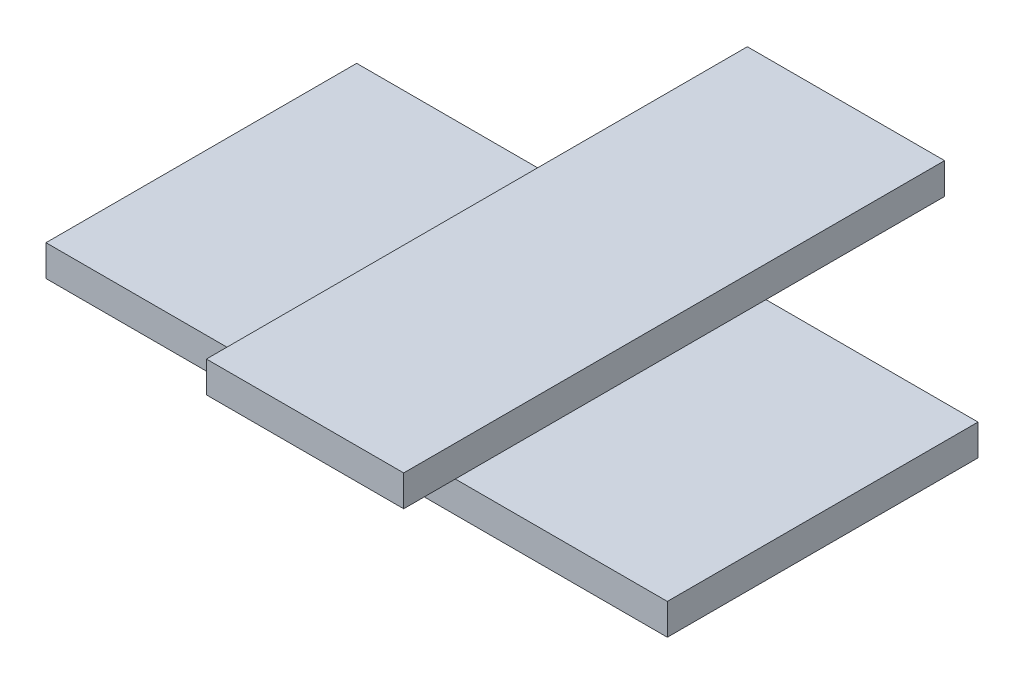
ISO-10303-21;
HEADER;
FILE_DESCRIPTION(('STEP AP214'),'2;1');
FILE_NAME('part.step','',(''),(''),'','','');
FILE_SCHEMA(('AUTOMOTIVE_DESIGN { 1 0 10303 214 1 1 1 1 }'));
ENDSEC;
DATA;
#1=APPLICATION_CONTEXT('core data for automotive mechanical design processes');
#2=APPLICATION_PROTOCOL_DEFINITION('international standard','automotive_design',2000,#1);
#3=PRODUCT_CONTEXT('',#1,'mechanical');
#4=PRODUCT('Part','Part','',(#3));
#5=PRODUCT_RELATED_PRODUCT_CATEGORY('part','',(#4));
#6=PRODUCT_DEFINITION_FORMATION('','',#4);
#7=PRODUCT_DEFINITION_CONTEXT('part definition',#1,'design');
#8=PRODUCT_DEFINITION('design','',#6,#7);
#9=PRODUCT_DEFINITION_SHAPE('','',#8);
#10=(LENGTH_UNIT() NAMED_UNIT(*) SI_UNIT(.MILLI.,.METRE.));
#11=(NAMED_UNIT(*) PLANE_ANGLE_UNIT() SI_UNIT($,.RADIAN.));
#12=(NAMED_UNIT(*) SI_UNIT($,.STERADIAN.) SOLID_ANGLE_UNIT());
#13=UNCERTAINTY_MEASURE_WITH_UNIT(LENGTH_MEASURE(1.E-05),#10,'distance_accuracy_value','');
#14=(GEOMETRIC_REPRESENTATION_CONTEXT(3) GLOBAL_UNCERTAINTY_ASSIGNED_CONTEXT((#13)) GLOBAL_UNIT_ASSIGNED_CONTEXT((#10,
#11,#12)) REPRESENTATION_CONTEXT('',''));
#15=CARTESIAN_POINT('',(0.,0.,0.));
#16=DIRECTION('',(0.,0.,1.));
#17=DIRECTION('',(1.,0.,0.));
#18=AXIS2_PLACEMENT_3D('',#15,#16,#17);
#19=CARTESIAN_POINT('',(0.,10.,0.));
#20=DIRECTION('',(0.,-1.,0.));
#21=DIRECTION('',(0.,0.,-1.));
#22=AXIS2_PLACEMENT_3D('',#19,#20,#21);
#23=PLANE('',#22);
#24=DIRECTION('',(0.,0.,1.));
#25=VECTOR('',#24,1.);
#26=CARTESIAN_POINT('',(68.25,10.,-157.505814462809));
#27=LINE('',#26,#25);
#28=CARTESIAN_POINT('',(68.25,10.,-100.));
#29=VERTEX_POINT('',#28);
#30=CARTESIAN_POINT('',(68.25,10.,0.));
#31=VERTEX_POINT('',#30);
#32=EDGE_CURVE('E11',#29,#31,#27,.T.);
#33=ORIENTED_EDGE('',*,*,#32,.F.);
#34=DIRECTION('',(-1.,0.,0.));
#35=VECTOR('',#34,1.);
#36=CARTESIAN_POINT('',(0.,10.,-100.));
#37=LINE('',#36,#35);
#38=CARTESIAN_POINT('',(0.,10.,-100.));
#39=VERTEX_POINT('',#38);
#40=EDGE_CURVE('E171',#29,#39,#37,.T.);
#41=ORIENTED_EDGE('',*,*,#40,.T.);
#42=DIRECTION('',(0.,0.,1.));
#43=VECTOR('',#42,1.);
#44=CARTESIAN_POINT('',(0.,10.,0.));
#45=LINE('',#44,#43);
#46=CARTESIAN_POINT('',(0.,10.,0.));
#47=VERTEX_POINT('',#46);
#48=EDGE_CURVE('E158',#39,#47,#45,.T.);
#49=ORIENTED_EDGE('',*,*,#48,.T.);
#50=DIRECTION('',(1.,0.,0.));
#51=VECTOR('',#50,1.);
#52=CARTESIAN_POINT('',(0.,10.,0.));
#53=LINE('',#52,#51);
#54=EDGE_CURVE('E164',#47,#31,#53,.T.);
#55=ORIENTED_EDGE('',*,*,#54,.T.);
#56=EDGE_LOOP('',(#33,#41,#49,#55));
#57=FACE_BOUND('',#56,.T.);
#58=ADVANCED_FACE('F39',(#57),#23,.F.);
#59=DIRECTION('',(0.,0.,-1.));
#60=VECTOR('',#59,1.);
#61=CARTESIAN_POINT('',(131.75,10.,-157.505814462809));
#62=LINE('',#61,#60);
#63=CARTESIAN_POINT('',(131.75,10.,0.));
#64=VERTEX_POINT('',#63);
#65=CARTESIAN_POINT('',(131.75,10.,-100.));
#66=VERTEX_POINT('',#65);
#67=EDGE_CURVE('E49',#64,#66,#62,.T.);
#68=ORIENTED_EDGE('',*,*,#67,.F.);
#69=CARTESIAN_POINT('',(200.,10.,0.));
#70=VERTEX_POINT('',#69);
#71=EDGE_CURVE('E162',#64,#70,#53,.T.);
#72=ORIENTED_EDGE('',*,*,#71,.T.);
#73=DIRECTION('',(0.,0.,-1.));
#74=VECTOR('',#73,1.);
#75=CARTESIAN_POINT('',(200.,10.,0.));
#76=LINE('',#75,#74);
#77=CARTESIAN_POINT('',(200.,10.,-100.));
#78=VERTEX_POINT('',#77);
#79=EDGE_CURVE('E167',#70,#78,#76,.T.);
#80=ORIENTED_EDGE('',*,*,#79,.T.);
#81=EDGE_CURVE('E172',#78,#66,#37,.T.);
#82=ORIENTED_EDGE('',*,*,#81,.T.);
#83=EDGE_LOOP('',(#68,#72,#80,#82));
#84=FACE_BOUND('',#83,.T.);
#85=ADVANCED_FACE('F251',(#84),#23,.F.);
#86=CARTESIAN_POINT('',(0.,10.,0.));
#87=DIRECTION('',(1.,0.,0.));
#88=DIRECTION('',(0.,0.,-1.));
#89=AXIS2_PLACEMENT_3D('',#86,#87,#88);
#90=PLANE('',#89);
#91=DIRECTION('',(0.,0.,1.));
#92=VECTOR('',#91,1.);
#93=CARTESIAN_POINT('',(0.,0.,0.));
#94=LINE('',#93,#92);
#95=CARTESIAN_POINT('',(0.,0.,-100.));
#96=VERTEX_POINT('',#95);
#97=CARTESIAN_POINT('',(0.,0.,0.));
#98=VERTEX_POINT('',#97);
#99=EDGE_CURVE('E147',#96,#98,#94,.T.);
#100=ORIENTED_EDGE('',*,*,#99,.T.);
#101=DIRECTION('',(0.,-1.,0.));
#102=VECTOR('',#101,1.);
#103=CARTESIAN_POINT('',(0.,10.,0.));
#104=LINE('',#103,#102);
#105=EDGE_CURVE('E43',#47,#98,#104,.T.);
#106=ORIENTED_EDGE('',*,*,#105,.F.);
#107=ORIENTED_EDGE('',*,*,#48,.F.);
#108=DIRECTION('',(0.,-1.,0.));
#109=VECTOR('',#108,1.);
#110=CARTESIAN_POINT('',(0.,10.,-100.));
#111=LINE('',#110,#109);
#112=EDGE_CURVE('E174',#39,#96,#111,.T.);
#113=ORIENTED_EDGE('',*,*,#112,.T.);
#114=EDGE_LOOP('',(#100,#106,#107,#113));
#115=FACE_BOUND('',#114,.T.);
#116=ADVANCED_FACE('F41',(#115),#90,.F.);
#117=CARTESIAN_POINT('',(0.,10.,0.));
#118=DIRECTION('',(0.,0.,-1.));
#119=DIRECTION('',(-1.,0.,0.));
#120=AXIS2_PLACEMENT_3D('',#117,#118,#119);
#121=PLANE('',#120);
#122=DIRECTION('',(1.,0.,0.));
#123=VECTOR('',#122,1.);
#124=CARTESIAN_POINT('',(0.,0.,0.));
#125=LINE('',#124,#123);
#126=CARTESIAN_POINT('',(200.,0.,0.));
#127=VERTEX_POINT('',#126);
#128=EDGE_CURVE('E152',#98,#127,#125,.T.);
#129=ORIENTED_EDGE('',*,*,#128,.T.);
#130=DIRECTION('',(0.,-1.,0.));
#131=VECTOR('',#130,1.);
#132=CARTESIAN_POINT('',(200.,10.,0.));
#133=LINE('',#132,#131);
#134=EDGE_CURVE('E190',#70,#127,#133,.T.);
#135=ORIENTED_EDGE('',*,*,#134,.F.);
#136=ORIENTED_EDGE('',*,*,#71,.F.);
#137=EDGE_CURVE('E168',#31,#64,#53,.T.);
#138=ORIENTED_EDGE('',*,*,#137,.F.);
#139=ORIENTED_EDGE('',*,*,#54,.F.);
#140=ORIENTED_EDGE('',*,*,#105,.T.);
#141=EDGE_LOOP('',(#129,#135,#136,#138,#139,#140));
#142=FACE_BOUND('',#141,.T.);
#143=ADVANCED_FACE('F247',(#142),#121,.F.);
#144=CARTESIAN_POINT('',(200.,10.,0.));
#145=DIRECTION('',(-1.,0.,0.));
#146=DIRECTION('',(0.,0.,1.));
#147=AXIS2_PLACEMENT_3D('',#144,#145,#146);
#148=PLANE('',#147);
#149=DIRECTION('',(0.,0.,-1.));
#150=VECTOR('',#149,1.);
#151=CARTESIAN_POINT('',(200.,0.,0.));
#152=LINE('',#151,#150);
#153=CARTESIAN_POINT('',(200.,0.,-100.));
#154=VERTEX_POINT('',#153);
#155=EDGE_CURVE('E179',#127,#154,#152,.T.);
#156=ORIENTED_EDGE('',*,*,#155,.T.);
#157=DIRECTION('',(0.,-1.,0.));
#158=VECTOR('',#157,1.);
#159=CARTESIAN_POINT('',(200.,10.,-100.));
#160=LINE('',#159,#158);
#161=EDGE_CURVE('E187',#78,#154,#160,.T.);
#162=ORIENTED_EDGE('',*,*,#161,.F.);
#163=ORIENTED_EDGE('',*,*,#79,.F.);
#164=ORIENTED_EDGE('',*,*,#134,.T.);
#165=EDGE_LOOP('',(#156,#162,#163,#164));
#166=FACE_BOUND('',#165,.T.);
#167=ADVANCED_FACE('F250',(#166),#148,.F.);
#168=CARTESIAN_POINT('',(0.,10.,-100.));
#169=DIRECTION('',(0.,0.,1.));
#170=DIRECTION('',(1.,0.,0.));
#171=AXIS2_PLACEMENT_3D('',#168,#169,#170);
#172=PLANE('',#171);
#173=DIRECTION('',(-1.,0.,0.));
#174=VECTOR('',#173,1.);
#175=CARTESIAN_POINT('',(0.,0.,-100.));
#176=LINE('',#175,#174);
#177=EDGE_CURVE('E163',#154,#96,#176,.T.);
#178=ORIENTED_EDGE('',*,*,#177,.T.);
#179=ORIENTED_EDGE('',*,*,#112,.F.);
#180=ORIENTED_EDGE('',*,*,#40,.F.);
#181=EDGE_CURVE('E175',#66,#29,#37,.T.);
#182=ORIENTED_EDGE('',*,*,#181,.F.);
#183=ORIENTED_EDGE('',*,*,#81,.F.);
#184=ORIENTED_EDGE('',*,*,#161,.T.);
#185=EDGE_LOOP('',(#178,#179,#180,#182,#183,#184));
#186=FACE_BOUND('',#185,.T.);
#187=ADVANCED_FACE('F241',(#186),#172,.F.);
#188=CARTESIAN_POINT('',(0.,0.,0.));
#189=DIRECTION('',(0.,-1.,0.));
#190=DIRECTION('',(0.,0.,-1.));
#191=AXIS2_PLACEMENT_3D('',#188,#189,#190);
#192=PLANE('',#191);
#193=ORIENTED_EDGE('',*,*,#99,.F.);
#194=ORIENTED_EDGE('',*,*,#177,.F.);
#195=ORIENTED_EDGE('',*,*,#155,.F.);
#196=ORIENTED_EDGE('',*,*,#128,.F.);
#197=EDGE_LOOP('',(#193,#194,#195,#196));
#198=FACE_BOUND('',#197,.T.);
#199=ADVANCED_FACE('F246',(#198),#192,.T.);
#200=CARTESIAN_POINT('',(0.,10.,0.));
#201=DIRECTION('',(0.,1.,0.));
#202=DIRECTION('',(0.,0.,1.));
#203=AXIS2_PLACEMENT_3D('',#200,#201,#202);
#204=PLANE('',#203);
#205=CARTESIAN_POINT('',(68.25,10.,16.6116935371907));
#206=VERTEX_POINT('',#205);
#207=EDGE_CURVE('E52',#31,#206,#27,.T.);
#208=ORIENTED_EDGE('',*,*,#207,.F.);
#209=ORIENTED_EDGE('',*,*,#137,.T.);
#210=CARTESIAN_POINT('',(131.75,10.,16.6116935371907));
#211=VERTEX_POINT('',#210);
#212=EDGE_CURVE('E203',#211,#64,#62,.T.);
#213=ORIENTED_EDGE('',*,*,#212,.F.);
#214=DIRECTION('',(1.,0.,0.));
#215=VECTOR('',#214,1.);
#216=CARTESIAN_POINT('',(68.25,10.,16.6116935371907));
#217=LINE('',#216,#215);
#218=EDGE_CURVE('E211',#206,#211,#217,.T.);
#219=ORIENTED_EDGE('',*,*,#218,.F.);
#220=EDGE_LOOP('',(#208,#209,#213,#219));
#221=FACE_BOUND('',#220,.T.);
#222=ADVANCED_FACE('F256',(#221),#204,.F.);
#223=CARTESIAN_POINT('',(131.75,10.,-157.505814462809));
#224=VERTEX_POINT('',#223);
#225=EDGE_CURVE('E204',#66,#224,#62,.T.);
#226=ORIENTED_EDGE('',*,*,#225,.F.);
#227=ORIENTED_EDGE('',*,*,#181,.T.);
#228=CARTESIAN_POINT('',(68.25,10.,-157.505814462809));
#229=VERTEX_POINT('',#228);
#230=EDGE_CURVE('E51',#229,#29,#27,.T.);
#231=ORIENTED_EDGE('',*,*,#230,.F.);
#232=DIRECTION('',(-1.,0.,0.));
#233=VECTOR('',#232,1.);
#234=CARTESIAN_POINT('',(68.25,10.,-157.505814462809));
#235=LINE('',#234,#233);
#236=EDGE_CURVE('E140',#224,#229,#235,.T.);
#237=ORIENTED_EDGE('',*,*,#236,.F.);
#238=EDGE_LOOP('',(#226,#227,#231,#237));
#239=FACE_BOUND('',#238,.T.);
#240=ADVANCED_FACE('F233',(#239),#204,.F.);
#241=CARTESIAN_POINT('',(68.25,20.,-157.505814462809));
#242=DIRECTION('',(1.,0.,0.));
#243=DIRECTION('',(0.,0.,-1.));
#244=AXIS2_PLACEMENT_3D('',#241,#242,#243);
#245=PLANE('',#244);
#246=ORIENTED_EDGE('',*,*,#230,.T.);
#247=ORIENTED_EDGE('',*,*,#32,.T.);
#248=ORIENTED_EDGE('',*,*,#207,.T.);
#249=DIRECTION('',(0.,-1.,0.));
#250=VECTOR('',#249,1.);
#251=CARTESIAN_POINT('',(68.25,20.,16.6116935371907));
#252=LINE('',#251,#250);
#253=CARTESIAN_POINT('',(68.25,20.,16.6116935371907));
#254=VERTEX_POINT('',#253);
#255=EDGE_CURVE('E123',#254,#206,#252,.T.);
#256=ORIENTED_EDGE('',*,*,#255,.F.);
#257=DIRECTION('',(0.,0.,1.));
#258=VECTOR('',#257,1.);
#259=CARTESIAN_POINT('',(68.25,20.,-157.505814462809));
#260=LINE('',#259,#258);
#261=CARTESIAN_POINT('',(68.25,20.,-157.505814462809));
#262=VERTEX_POINT('',#261);
#263=EDGE_CURVE('E130',#262,#254,#260,.T.);
#264=ORIENTED_EDGE('',*,*,#263,.F.);
#265=DIRECTION('',(0.,-1.,0.));
#266=VECTOR('',#265,1.);
#267=CARTESIAN_POINT('',(68.25,20.,-157.505814462809));
#268=LINE('',#267,#266);
#269=EDGE_CURVE('E220',#262,#229,#268,.T.);
#270=ORIENTED_EDGE('',*,*,#269,.T.);
#271=EDGE_LOOP('',(#246,#247,#248,#256,#264,#270));
#272=FACE_BOUND('',#271,.T.);
#273=ADVANCED_FACE('F143',(#272),#245,.F.);
#274=CARTESIAN_POINT('',(68.25,20.,16.6116935371907));
#275=DIRECTION('',(0.,0.,-1.));
#276=DIRECTION('',(-1.,0.,0.));
#277=AXIS2_PLACEMENT_3D('',#274,#275,#276);
#278=PLANE('',#277);
#279=ORIENTED_EDGE('',*,*,#218,.T.);
#280=DIRECTION('',(0.,-1.,0.));
#281=VECTOR('',#280,1.);
#282=CARTESIAN_POINT('',(131.75,20.,16.6116935371907));
#283=LINE('',#282,#281);
#284=CARTESIAN_POINT('',(131.75,20.,16.6116935371907));
#285=VERTEX_POINT('',#284);
#286=EDGE_CURVE('E125',#285,#211,#283,.T.);
#287=ORIENTED_EDGE('',*,*,#286,.F.);
#288=DIRECTION('',(1.,0.,0.));
#289=VECTOR('',#288,1.);
#290=CARTESIAN_POINT('',(68.25,20.,16.6116935371907));
#291=LINE('',#290,#289);
#292=EDGE_CURVE('E119',#254,#285,#291,.T.);
#293=ORIENTED_EDGE('',*,*,#292,.F.);
#294=ORIENTED_EDGE('',*,*,#255,.T.);
#295=EDGE_LOOP('',(#279,#287,#293,#294));
#296=FACE_BOUND('',#295,.T.);
#297=ADVANCED_FACE('F121',(#296),#278,.F.);
#298=CARTESIAN_POINT('',(131.75,20.,-157.505814462809));
#299=DIRECTION('',(-1.,0.,0.));
#300=DIRECTION('',(0.,0.,1.));
#301=AXIS2_PLACEMENT_3D('',#298,#299,#300);
#302=PLANE('',#301);
#303=ORIENTED_EDGE('',*,*,#212,.T.);
#304=ORIENTED_EDGE('',*,*,#67,.T.);
#305=ORIENTED_EDGE('',*,*,#225,.T.);
#306=DIRECTION('',(0.,-1.,0.));
#307=VECTOR('',#306,1.);
#308=CARTESIAN_POINT('',(131.75,20.,-157.505814462809));
#309=LINE('',#308,#307);
#310=CARTESIAN_POINT('',(131.75,20.,-157.505814462809));
#311=VERTEX_POINT('',#310);
#312=EDGE_CURVE('E154',#311,#224,#309,.T.);
#313=ORIENTED_EDGE('',*,*,#312,.F.);
#314=DIRECTION('',(0.,0.,-1.));
#315=VECTOR('',#314,1.);
#316=CARTESIAN_POINT('',(131.75,20.,-157.505814462809));
#317=LINE('',#316,#315);
#318=EDGE_CURVE('E129',#285,#311,#317,.T.);
#319=ORIENTED_EDGE('',*,*,#318,.F.);
#320=ORIENTED_EDGE('',*,*,#286,.T.);
#321=EDGE_LOOP('',(#303,#304,#305,#313,#319,#320));
#322=FACE_BOUND('',#321,.T.);
#323=ADVANCED_FACE('F222',(#322),#302,.F.);
#324=CARTESIAN_POINT('',(68.25,20.,-157.505814462809));
#325=DIRECTION('',(0.,0.,1.));
#326=DIRECTION('',(1.,0.,0.));
#327=AXIS2_PLACEMENT_3D('',#324,#325,#326);
#328=PLANE('',#327);
#329=ORIENTED_EDGE('',*,*,#236,.T.);
#330=ORIENTED_EDGE('',*,*,#269,.F.);
#331=DIRECTION('',(-1.,0.,0.));
#332=VECTOR('',#331,1.);
#333=CARTESIAN_POINT('',(68.25,20.,-157.505814462809));
#334=LINE('',#333,#332);
#335=EDGE_CURVE('E135',#311,#262,#334,.T.);
#336=ORIENTED_EDGE('',*,*,#335,.F.);
#337=ORIENTED_EDGE('',*,*,#312,.T.);
#338=EDGE_LOOP('',(#329,#330,#336,#337));
#339=FACE_BOUND('',#338,.T.);
#340=ADVANCED_FACE('F226',(#339),#328,.F.);
#341=CARTESIAN_POINT('',(0.,20.,0.));
#342=DIRECTION('',(0.,1.,0.));
#343=DIRECTION('',(0.,0.,1.));
#344=AXIS2_PLACEMENT_3D('',#341,#342,#343);
#345=PLANE('',#344);
#346=ORIENTED_EDGE('',*,*,#263,.T.);
#347=ORIENTED_EDGE('',*,*,#292,.T.);
#348=ORIENTED_EDGE('',*,*,#318,.T.);
#349=ORIENTED_EDGE('',*,*,#335,.T.);
#350=EDGE_LOOP('',(#346,#347,#348,#349));
#351=FACE_BOUND('',#350,.T.);
#352=ADVANCED_FACE('F133',(#351),#345,.T.);
#353=CLOSED_SHELL('',(#58,#85,#116,#143,#167,#187,#199,#222,#240,#273,#297,#323,#340,#352));
#354=MANIFOLD_SOLID_BREP('B2',#353);
#355=ADVANCED_BREP_SHAPE_REPRESENTATION('',(#18,#354),#14);
#356=SHAPE_DEFINITION_REPRESENTATION(#9,#355);
ENDSEC;
END-ISO-10303-21;
